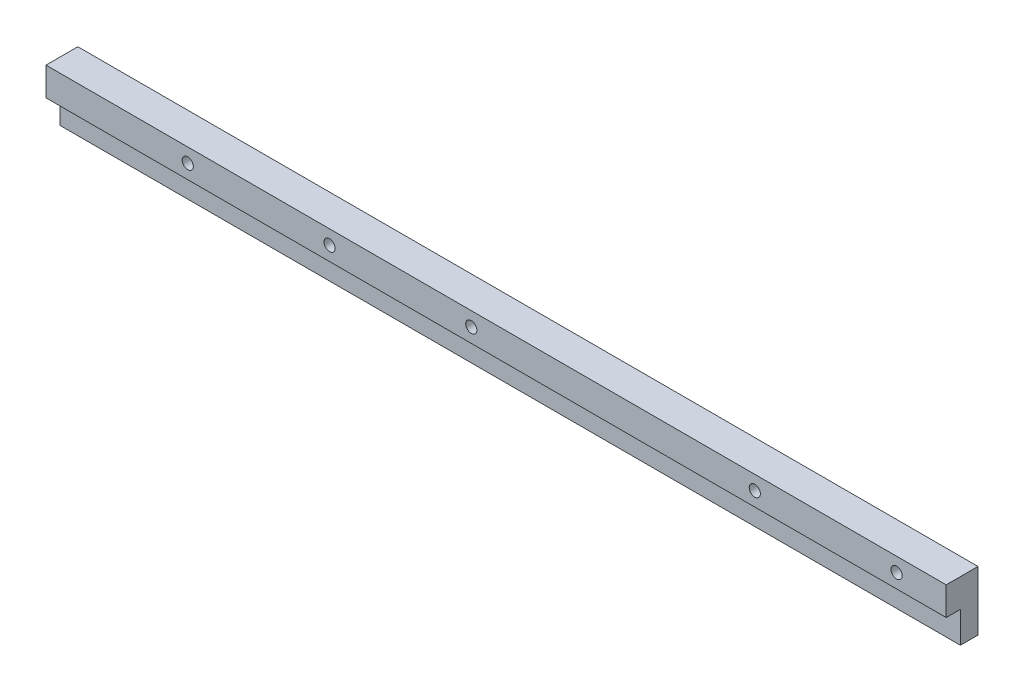
ISO-10303-21;
HEADER;
FILE_DESCRIPTION(('STEP AP214'),'2;1');
FILE_NAME('part.step','',(''),(''),'','','');
FILE_SCHEMA(('AUTOMOTIVE_DESIGN { 1 0 10303 214 1 1 1 1 }'));
ENDSEC;
DATA;
#1=APPLICATION_CONTEXT('core data for automotive mechanical design processes');
#2=APPLICATION_PROTOCOL_DEFINITION('international standard','automotive_design',2000,#1);
#3=PRODUCT_CONTEXT('',#1,'mechanical');
#4=PRODUCT('Part','Part','',(#3));
#5=PRODUCT_RELATED_PRODUCT_CATEGORY('part','',(#4));
#6=PRODUCT_DEFINITION_FORMATION('','',#4);
#7=PRODUCT_DEFINITION_CONTEXT('part definition',#1,'design');
#8=PRODUCT_DEFINITION('design','',#6,#7);
#9=PRODUCT_DEFINITION_SHAPE('','',#8);
#10=(LENGTH_UNIT() NAMED_UNIT(*) SI_UNIT(.MILLI.,.METRE.));
#11=(NAMED_UNIT(*) PLANE_ANGLE_UNIT() SI_UNIT($,.RADIAN.));
#12=(NAMED_UNIT(*) SI_UNIT($,.STERADIAN.) SOLID_ANGLE_UNIT());
#13=UNCERTAINTY_MEASURE_WITH_UNIT(LENGTH_MEASURE(1.E-05),#10,'distance_accuracy_value','');
#14=(GEOMETRIC_REPRESENTATION_CONTEXT(3) GLOBAL_UNCERTAINTY_ASSIGNED_CONTEXT((#13)) GLOBAL_UNIT_ASSIGNED_CONTEXT((#10,
#11,#12)) REPRESENTATION_CONTEXT('',''));
#15=CARTESIAN_POINT('',(0.,0.,0.));
#16=DIRECTION('',(0.,0.,1.));
#17=DIRECTION('',(1.,0.,0.));
#18=AXIS2_PLACEMENT_3D('',#15,#16,#17);
#19=CARTESIAN_POINT('',(-78.5137673299967,186.711667893958,0.));
#20=DIRECTION('',(0.,-1.,0.));
#21=DIRECTION('',(0.,0.,-1.));
#22=AXIS2_PLACEMENT_3D('',#19,#20,#21);
#23=PLANE('',#22);
#24=DIRECTION('',(1.,0.,0.));
#25=VECTOR('',#24,1.);
#26=CARTESIAN_POINT('',(-78.5137673299967,186.711667893958,-5.09491902004522));
#27=LINE('',#26,#25);
#28=CARTESIAN_POINT('',(-78.5137673299967,186.711667893958,-5.09491902004522));
#29=VERTEX_POINT('',#28);
#30=CARTESIAN_POINT('',(244.066232670003,186.711667893958,-5.09491902004522));
#31=VERTEX_POINT('',#30);
#32=EDGE_CURVE('E137',#29,#31,#27,.T.);
#33=ORIENTED_EDGE('',*,*,#32,.T.);
#34=DIRECTION('',(0.,0.,1.));
#35=VECTOR('',#34,1.);
#36=CARTESIAN_POINT('',(244.066232670003,186.711667893958,0.));
#37=LINE('',#36,#35);
#38=CARTESIAN_POINT('',(244.066232670003,186.711667893958,0.));
#39=VERTEX_POINT('',#38);
#40=EDGE_CURVE('E61',#31,#39,#37,.T.);
#41=ORIENTED_EDGE('',*,*,#40,.T.);
#42=DIRECTION('',(1.,0.,0.));
#43=VECTOR('',#42,1.);
#44=CARTESIAN_POINT('',(-78.5137673299967,186.711667893958,0.));
#45=LINE('',#44,#43);
#46=CARTESIAN_POINT('',(-78.5137673299967,186.711667893958,0.));
#47=VERTEX_POINT('',#46);
#48=EDGE_CURVE('E68',#47,#39,#45,.T.);
#49=ORIENTED_EDGE('',*,*,#48,.F.);
#50=DIRECTION('',(0.,0.,-1.));
#51=VECTOR('',#50,1.);
#52=CARTESIAN_POINT('',(-78.5137673299967,186.711667893958,0.));
#53=LINE('',#52,#51);
#54=EDGE_CURVE('E158',#47,#29,#53,.T.);
#55=ORIENTED_EDGE('',*,*,#54,.T.);
#56=EDGE_LOOP('',(#33,#41,#49,#55));
#57=FACE_BOUND('',#56,.T.);
#58=ADVANCED_FACE('F47',(#57),#23,.T.);
#59=CARTESIAN_POINT('',(-78.5137673299967,196.871667893958,0.));
#60=DIRECTION('',(0.,-1.,0.));
#61=DIRECTION('',(0.,0.,-1.));
#62=AXIS2_PLACEMENT_3D('',#59,#60,#61);
#63=PLANE('',#62);
#64=DIRECTION('',(0.,0.,1.));
#65=VECTOR('',#64,1.);
#66=CARTESIAN_POINT('',(244.066232670003,196.871667893958,0.));
#67=LINE('',#66,#65);
#68=CARTESIAN_POINT('',(244.066232670003,196.871667893958,-11.405822057911));
#69=VERTEX_POINT('',#68);
#70=CARTESIAN_POINT('',(244.066232670003,196.871667893958,0.));
#71=VERTEX_POINT('',#70);
#72=EDGE_CURVE('E109',#69,#71,#67,.T.);
#73=ORIENTED_EDGE('',*,*,#72,.F.);
#74=DIRECTION('',(1.,0.,0.));
#75=VECTOR('',#74,1.);
#76=CARTESIAN_POINT('',(-78.5137673299967,196.871667893958,-11.405822057911));
#77=LINE('',#76,#75);
#78=CARTESIAN_POINT('',(-78.5137673299967,196.871667893958,-11.405822057911));
#79=VERTEX_POINT('',#78);
#80=EDGE_CURVE('E124',#79,#69,#77,.T.);
#81=ORIENTED_EDGE('',*,*,#80,.F.);
#82=DIRECTION('',(0.,0.,-1.));
#83=VECTOR('',#82,1.);
#84=CARTESIAN_POINT('',(-78.5137673299967,196.871667893958,0.));
#85=LINE('',#84,#83);
#86=CARTESIAN_POINT('',(-78.5137673299967,196.871667893958,0.));
#87=VERTEX_POINT('',#86);
#88=EDGE_CURVE('E120',#87,#79,#85,.T.);
#89=ORIENTED_EDGE('',*,*,#88,.F.);
#90=DIRECTION('',(1.,0.,0.));
#91=VECTOR('',#90,1.);
#92=CARTESIAN_POINT('',(-78.5137673299967,196.871667893958,0.));
#93=LINE('',#92,#91);
#94=EDGE_CURVE('E55',#87,#71,#93,.T.);
#95=ORIENTED_EDGE('',*,*,#94,.T.);
#96=EDGE_LOOP('',(#73,#81,#89,#95));
#97=FACE_BOUND('',#96,.T.);
#98=ADVANCED_FACE('F119',(#97),#63,.F.);
#99=CARTESIAN_POINT('',(-78.5137673299967,0.,-11.405822057911));
#100=DIRECTION('',(0.,0.,1.));
#101=DIRECTION('',(0.,-1.,0.));
#102=AXIS2_PLACEMENT_3D('',#99,#100,#101);
#103=PLANE('',#102);
#104=CARTESIAN_POINT('',(226.286232670003,191.791667893958,-11.405822057911));
#105=DIRECTION('',(0.,0.,-1.));
#106=DIRECTION('',(0.,1.,0.));
#107=AXIS2_PLACEMENT_3D('',#104,#105,#106);
#108=CIRCLE('',#107,2.);
#109=CARTESIAN_POINT('',(226.286232670003,193.791667893958,-11.405822057911));
#110=VERTEX_POINT('',#109);
#111=EDGE_CURVE('E175',#110,#110,#108,.T.);
#112=ORIENTED_EDGE('',*,*,#111,.F.);
#113=EDGE_LOOP('',(#112));
#114=FACE_BOUND('',#113,.T.);
#115=CARTESIAN_POINT('',(175.486232670003,191.791667893958,-11.405822057911));
#116=DIRECTION('',(0.,0.,-1.));
#117=DIRECTION('',(0.,1.,0.));
#118=AXIS2_PLACEMENT_3D('',#115,#116,#117);
#119=CIRCLE('',#118,2.);
#120=CARTESIAN_POINT('',(175.486232670003,193.791667893958,-11.405822057911));
#121=VERTEX_POINT('',#120);
#122=EDGE_CURVE('E189',#121,#121,#119,.T.);
#123=ORIENTED_EDGE('',*,*,#122,.F.);
#124=EDGE_LOOP('',(#123));
#125=FACE_BOUND('',#124,.T.);
#126=CARTESIAN_POINT('',(73.8862326700033,191.791667893958,-11.405822057911));
#127=DIRECTION('',(0.,0.,-1.));
#128=DIRECTION('',(0.,1.,0.));
#129=AXIS2_PLACEMENT_3D('',#126,#127,#128);
#130=CIRCLE('',#129,2.);
#131=CARTESIAN_POINT('',(73.8862326700033,193.791667893958,-11.405822057911));
#132=VERTEX_POINT('',#131);
#133=EDGE_CURVE('E185',#132,#132,#130,.T.);
#134=ORIENTED_EDGE('',*,*,#133,.F.);
#135=EDGE_LOOP('',(#134));
#136=FACE_BOUND('',#135,.T.);
#137=CARTESIAN_POINT('',(23.0862326700033,191.791667893958,-11.405822057911));
#138=DIRECTION('',(0.,0.,-1.));
#139=DIRECTION('',(0.,1.,0.));
#140=AXIS2_PLACEMENT_3D('',#137,#138,#139);
#141=CIRCLE('',#140,2.);
#142=CARTESIAN_POINT('',(23.0862326700033,193.791667893958,-11.405822057911));
#143=VERTEX_POINT('',#142);
#144=EDGE_CURVE('E180',#143,#143,#141,.T.);
#145=ORIENTED_EDGE('',*,*,#144,.F.);
#146=EDGE_LOOP('',(#145));
#147=FACE_BOUND('',#146,.T.);
#148=CARTESIAN_POINT('',(-27.7137673299967,191.791667893958,-11.405822057911));
#149=DIRECTION('',(0.,0.,-1.));
#150=DIRECTION('',(0.,1.,0.));
#151=AXIS2_PLACEMENT_3D('',#148,#149,#150);
#152=CIRCLE('',#151,2.);
#153=CARTESIAN_POINT('',(-27.7137673299967,193.791667893958,-11.405822057911));
#154=VERTEX_POINT('',#153);
#155=EDGE_CURVE('E176',#154,#154,#152,.T.);
#156=ORIENTED_EDGE('',*,*,#155,.F.);
#157=EDGE_LOOP('',(#156));
#158=FACE_BOUND('',#157,.T.);
#159=DIRECTION('',(0.,1.,0.));
#160=VECTOR('',#159,1.);
#161=CARTESIAN_POINT('',(244.066232670003,0.,-11.405822057911));
#162=LINE('',#161,#160);
#163=CARTESIAN_POINT('',(244.066232670003,175.560674011247,-11.405822057911));
#164=VERTEX_POINT('',#163);
#165=EDGE_CURVE('E112',#164,#69,#162,.T.);
#166=ORIENTED_EDGE('',*,*,#165,.F.);
#167=DIRECTION('',(1.,0.,0.));
#168=VECTOR('',#167,1.);
#169=CARTESIAN_POINT('',(-78.5137673299967,175.560674011247,-11.405822057911));
#170=LINE('',#169,#168);
#171=CARTESIAN_POINT('',(-78.5137673299967,175.560674011247,-11.405822057911));
#172=VERTEX_POINT('',#171);
#173=EDGE_CURVE('E130',#172,#164,#170,.T.);
#174=ORIENTED_EDGE('',*,*,#173,.F.);
#175=DIRECTION('',(0.,-1.,0.));
#176=VECTOR('',#175,1.);
#177=CARTESIAN_POINT('',(-78.5137673299967,0.,-11.405822057911));
#178=LINE('',#177,#176);
#179=EDGE_CURVE('E146',#79,#172,#178,.T.);
#180=ORIENTED_EDGE('',*,*,#179,.F.);
#181=ORIENTED_EDGE('',*,*,#80,.T.);
#182=EDGE_LOOP('',(#166,#174,#180,#181));
#183=FACE_BOUND('',#182,.T.);
#184=ADVANCED_FACE('F241',(#114,#125,#136,#147,#158,#183),#103,.F.);
#185=CARTESIAN_POINT('',(-78.5137673299967,175.560674011247,0.));
#186=DIRECTION('',(0.,-1.,0.));
#187=DIRECTION('',(0.,0.,-1.));
#188=AXIS2_PLACEMENT_3D('',#185,#186,#187);
#189=PLANE('',#188);
#190=ORIENTED_EDGE('',*,*,#173,.T.);
#191=DIRECTION('',(0.,0.,1.));
#192=VECTOR('',#191,1.);
#193=CARTESIAN_POINT('',(244.066232670003,175.560674011247,0.));
#194=LINE('',#193,#192);
#195=CARTESIAN_POINT('',(244.066232670003,175.560674011247,-5.09491902004522));
#196=VERTEX_POINT('',#195);
#197=EDGE_CURVE('E105',#164,#196,#194,.T.);
#198=ORIENTED_EDGE('',*,*,#197,.T.);
#199=DIRECTION('',(1.,0.,0.));
#200=VECTOR('',#199,1.);
#201=CARTESIAN_POINT('',(-78.5137673299967,175.560674011247,-5.09491902004522));
#202=LINE('',#201,#200);
#203=CARTESIAN_POINT('',(-78.5137673299967,175.560674011247,-5.09491902004522));
#204=VERTEX_POINT('',#203);
#205=EDGE_CURVE('E134',#204,#196,#202,.T.);
#206=ORIENTED_EDGE('',*,*,#205,.F.);
#207=DIRECTION('',(0.,0.,-1.));
#208=VECTOR('',#207,1.);
#209=CARTESIAN_POINT('',(-78.5137673299967,175.560674011247,0.));
#210=LINE('',#209,#208);
#211=EDGE_CURVE('E151',#204,#172,#210,.T.);
#212=ORIENTED_EDGE('',*,*,#211,.T.);
#213=EDGE_LOOP('',(#190,#198,#206,#212));
#214=FACE_BOUND('',#213,.T.);
#215=ADVANCED_FACE('F245',(#214),#189,.T.);
#216=CARTESIAN_POINT('',(-78.5137673299967,0.,-5.09491902004522));
#217=DIRECTION('',(0.,0.,-1.));
#218=DIRECTION('',(-1.,0.,0.));
#219=AXIS2_PLACEMENT_3D('',#216,#217,#218);
#220=PLANE('',#219);
#221=DIRECTION('',(0.,-1.,0.));
#222=VECTOR('',#221,1.);
#223=CARTESIAN_POINT('',(244.066232670003,0.,-5.09491902004522));
#224=LINE('',#223,#222);
#225=EDGE_CURVE('E11',#31,#196,#224,.T.);
#226=ORIENTED_EDGE('',*,*,#225,.F.);
#227=ORIENTED_EDGE('',*,*,#32,.F.);
#228=DIRECTION('',(0.,1.,0.));
#229=VECTOR('',#228,1.);
#230=CARTESIAN_POINT('',(-78.5137673299967,0.,-5.09491902004522));
#231=LINE('',#230,#229);
#232=EDGE_CURVE('E155',#204,#29,#231,.T.);
#233=ORIENTED_EDGE('',*,*,#232,.F.);
#234=ORIENTED_EDGE('',*,*,#205,.T.);
#235=EDGE_LOOP('',(#226,#227,#233,#234));
#236=FACE_BOUND('',#235,.T.);
#237=ADVANCED_FACE('F213',(#236),#220,.F.);
#238=CARTESIAN_POINT('',(-78.5137673299967,0.,0.));
#239=DIRECTION('',(0.,0.,-1.));
#240=DIRECTION('',(-1.,0.,0.));
#241=AXIS2_PLACEMENT_3D('',#238,#239,#240);
#242=PLANE('',#241);
#243=CARTESIAN_POINT('',(175.486232670003,191.791667893958,0.));
#244=DIRECTION('',(0.,0.,-1.));
#245=DIRECTION('',(-1.,0.,0.));
#246=AXIS2_PLACEMENT_3D('',#243,#244,#245);
#247=CIRCLE('',#246,2.);
#248=CARTESIAN_POINT('',(173.486232670003,191.791667893958,0.));
#249=VERTEX_POINT('',#248);
#250=EDGE_CURVE('E106',#249,#249,#247,.T.);
#251=ORIENTED_EDGE('',*,*,#250,.T.);
#252=EDGE_LOOP('',(#251));
#253=FACE_BOUND('',#252,.T.);
#254=ORIENTED_EDGE('',*,*,#94,.F.);
#255=DIRECTION('',(0.,1.,0.));
#256=VECTOR('',#255,1.);
#257=CARTESIAN_POINT('',(-78.5137673299967,0.,0.));
#258=LINE('',#257,#256);
#259=EDGE_CURVE('E140',#47,#87,#258,.T.);
#260=ORIENTED_EDGE('',*,*,#259,.F.);
#261=ORIENTED_EDGE('',*,*,#48,.T.);
#262=DIRECTION('',(0.,-1.,0.));
#263=VECTOR('',#262,1.);
#264=CARTESIAN_POINT('',(244.066232670003,205.735677450543,0.));
#265=LINE('',#264,#263);
#266=EDGE_CURVE('E98',#71,#39,#265,.T.);
#267=ORIENTED_EDGE('',*,*,#266,.F.);
#268=EDGE_LOOP('',(#254,#260,#261,#267));
#269=FACE_BOUND('',#268,.T.);
#270=CARTESIAN_POINT('',(226.286232670003,191.791667893958,0.));
#271=DIRECTION('',(0.,0.,-1.));
#272=DIRECTION('',(-1.,0.,0.));
#273=AXIS2_PLACEMENT_3D('',#270,#271,#272);
#274=CIRCLE('',#273,2.);
#275=CARTESIAN_POINT('',(224.286232670003,191.791667893958,0.));
#276=VERTEX_POINT('',#275);
#277=EDGE_CURVE('E203',#276,#276,#274,.F.);
#278=ORIENTED_EDGE('',*,*,#277,.F.);
#279=EDGE_LOOP('',(#278));
#280=FACE_BOUND('',#279,.T.);
#281=CARTESIAN_POINT('',(73.8862326700033,191.791667893958,0.));
#282=DIRECTION('',(0.,0.,-1.));
#283=DIRECTION('',(-1.,0.,0.));
#284=AXIS2_PLACEMENT_3D('',#281,#282,#283);
#285=CIRCLE('',#284,2.);
#286=CARTESIAN_POINT('',(71.8862326700033,191.791667893958,0.));
#287=VERTEX_POINT('',#286);
#288=EDGE_CURVE('E199',#287,#287,#285,.F.);
#289=ORIENTED_EDGE('',*,*,#288,.F.);
#290=EDGE_LOOP('',(#289));
#291=FACE_BOUND('',#290,.T.);
#292=CARTESIAN_POINT('',(23.0862326700033,191.791667893958,0.));
#293=DIRECTION('',(0.,0.,-1.));
#294=DIRECTION('',(-1.,0.,0.));
#295=AXIS2_PLACEMENT_3D('',#292,#293,#294);
#296=CIRCLE('',#295,2.);
#297=CARTESIAN_POINT('',(21.0862326700033,191.791667893958,0.));
#298=VERTEX_POINT('',#297);
#299=EDGE_CURVE('E181',#298,#298,#296,.F.);
#300=ORIENTED_EDGE('',*,*,#299,.F.);
#301=EDGE_LOOP('',(#300));
#302=FACE_BOUND('',#301,.T.);
#303=CARTESIAN_POINT('',(-27.7137673299967,191.791667893958,0.));
#304=DIRECTION('',(0.,0.,-1.));
#305=DIRECTION('',(-1.,0.,0.));
#306=AXIS2_PLACEMENT_3D('',#303,#304,#305);
#307=CIRCLE('',#306,2.);
#308=CARTESIAN_POINT('',(-29.7137673299967,191.791667893958,0.));
#309=VERTEX_POINT('',#308);
#310=EDGE_CURVE('E171',#309,#309,#307,.T.);
#311=ORIENTED_EDGE('',*,*,#310,.T.);
#312=EDGE_LOOP('',(#311));
#313=FACE_BOUND('',#312,.T.);
#314=ADVANCED_FACE('F100',(#253,#269,#280,#291,#302,#313),#242,.F.);
#315=CARTESIAN_POINT('',(-78.5137673299967,0.,0.));
#316=DIRECTION('',(1.,0.,0.));
#317=DIRECTION('',(0.,0.,-1.));
#318=AXIS2_PLACEMENT_3D('',#315,#316,#317);
#319=PLANE('',#318);
#320=ORIENTED_EDGE('',*,*,#54,.F.);
#321=ORIENTED_EDGE('',*,*,#259,.T.);
#322=ORIENTED_EDGE('',*,*,#88,.T.);
#323=ORIENTED_EDGE('',*,*,#179,.T.);
#324=ORIENTED_EDGE('',*,*,#211,.F.);
#325=ORIENTED_EDGE('',*,*,#232,.T.);
#326=EDGE_LOOP('',(#320,#321,#322,#323,#324,#325));
#327=FACE_BOUND('',#326,.T.);
#328=ADVANCED_FACE('F212',(#327),#319,.F.);
#329=CARTESIAN_POINT('',(244.066232670003,0.,0.));
#330=DIRECTION('',(1.,0.,0.));
#331=DIRECTION('',(0.,0.,-1.));
#332=AXIS2_PLACEMENT_3D('',#329,#330,#331);
#333=PLANE('',#332);
#334=ORIENTED_EDGE('',*,*,#225,.T.);
#335=ORIENTED_EDGE('',*,*,#197,.F.);
#336=ORIENTED_EDGE('',*,*,#165,.T.);
#337=ORIENTED_EDGE('',*,*,#72,.T.);
#338=ORIENTED_EDGE('',*,*,#266,.T.);
#339=ORIENTED_EDGE('',*,*,#40,.F.);
#340=EDGE_LOOP('',(#334,#335,#336,#337,#338,#339));
#341=FACE_BOUND('',#340,.T.);
#342=ADVANCED_FACE('F110',(#341),#333,.T.);
#343=CARTESIAN_POINT('',(-27.7137673299967,191.791667893958,191.794177942089));
#344=DIRECTION('',(0.,0.,-1.));
#345=DIRECTION('',(0.,1.,0.));
#346=AXIS2_PLACEMENT_3D('',#343,#344,#345);
#347=CYLINDRICAL_SURFACE('',#346,2.);
#348=ORIENTED_EDGE('',*,*,#155,.T.);
#349=EDGE_LOOP('',(#348));
#350=FACE_BOUND('',#349,.T.);
#351=ORIENTED_EDGE('',*,*,#310,.F.);
#352=EDGE_LOOP('',(#351));
#353=FACE_BOUND('',#352,.T.);
#354=ADVANCED_FACE('F222',(#350,#353),#347,.F.);
#355=CARTESIAN_POINT('',(175.486232670003,191.791667893958,191.794177942089));
#356=DIRECTION('',(0.,0.,-1.));
#357=DIRECTION('',(0.,1.,0.));
#358=AXIS2_PLACEMENT_3D('',#355,#356,#357);
#359=CYLINDRICAL_SURFACE('',#358,2.);
#360=ORIENTED_EDGE('',*,*,#122,.T.);
#361=EDGE_LOOP('',(#360));
#362=FACE_BOUND('',#361,.T.);
#363=ORIENTED_EDGE('',*,*,#250,.F.);
#364=EDGE_LOOP('',(#363));
#365=FACE_BOUND('',#364,.T.);
#366=ADVANCED_FACE('F224',(#362,#365),#359,.F.);
#367=CARTESIAN_POINT('',(23.0862326700033,191.791667893958,191.794177942089));
#368=DIRECTION('',(0.,0.,-1.));
#369=DIRECTION('',(0.,1.,0.));
#370=AXIS2_PLACEMENT_3D('',#367,#368,#369);
#371=CYLINDRICAL_SURFACE('',#370,2.);
#372=ORIENTED_EDGE('',*,*,#299,.T.);
#373=EDGE_LOOP('',(#372));
#374=FACE_BOUND('',#373,.T.);
#375=ORIENTED_EDGE('',*,*,#144,.T.);
#376=EDGE_LOOP('',(#375));
#377=FACE_BOUND('',#376,.T.);
#378=ADVANCED_FACE('F231',(#374,#377),#371,.F.);
#379=CARTESIAN_POINT('',(73.8862326700033,191.791667893958,191.794177942089));
#380=DIRECTION('',(0.,0.,-1.));
#381=DIRECTION('',(0.,1.,0.));
#382=AXIS2_PLACEMENT_3D('',#379,#380,#381);
#383=CYLINDRICAL_SURFACE('',#382,2.);
#384=ORIENTED_EDGE('',*,*,#288,.T.);
#385=EDGE_LOOP('',(#384));
#386=FACE_BOUND('',#385,.T.);
#387=ORIENTED_EDGE('',*,*,#133,.T.);
#388=EDGE_LOOP('',(#387));
#389=FACE_BOUND('',#388,.T.);
#390=ADVANCED_FACE('F311',(#386,#389),#383,.F.);
#391=CARTESIAN_POINT('',(226.286232670003,191.791667893958,191.794177942089));
#392=DIRECTION('',(0.,0.,-1.));
#393=DIRECTION('',(0.,1.,0.));
#394=AXIS2_PLACEMENT_3D('',#391,#392,#393);
#395=CYLINDRICAL_SURFACE('',#394,2.);
#396=ORIENTED_EDGE('',*,*,#277,.T.);
#397=EDGE_LOOP('',(#396));
#398=FACE_BOUND('',#397,.T.);
#399=ORIENTED_EDGE('',*,*,#111,.T.);
#400=EDGE_LOOP('',(#399));
#401=FACE_BOUND('',#400,.T.);
#402=ADVANCED_FACE('F208',(#398,#401),#395,.F.);
#403=CLOSED_SHELL('',(#58,#98,#184,#215,#237,#314,#328,#342,#354,#366,#378,#390,#402));
#404=MANIFOLD_SOLID_BREP('B2',#403);
#405=ADVANCED_BREP_SHAPE_REPRESENTATION('',(#18,#404),#14);
#406=SHAPE_DEFINITION_REPRESENTATION(#9,#405);
ENDSEC;
END-ISO-10303-21;
